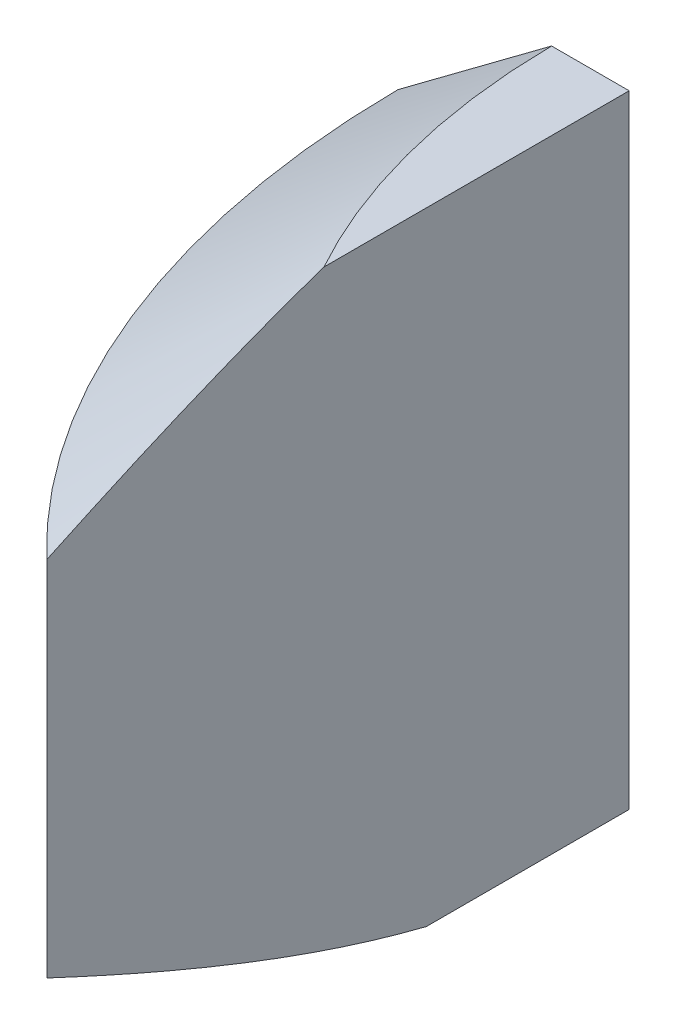
ISO-10303-21;
HEADER;
FILE_DESCRIPTION(('STEP AP214'),'2;1');
FILE_NAME('part.step','',(''),(''),'','','');
FILE_SCHEMA(('AUTOMOTIVE_DESIGN { 1 0 10303 214 1 1 1 1 }'));
ENDSEC;
DATA;
#1=APPLICATION_CONTEXT('core data for automotive mechanical design processes');
#2=APPLICATION_PROTOCOL_DEFINITION('international standard','automotive_design',2000,#1);
#3=PRODUCT_CONTEXT('',#1,'mechanical');
#4=PRODUCT('Part','Part','',(#3));
#5=PRODUCT_RELATED_PRODUCT_CATEGORY('part','',(#4));
#6=PRODUCT_DEFINITION_FORMATION('','',#4);
#7=PRODUCT_DEFINITION_CONTEXT('part definition',#1,'design');
#8=PRODUCT_DEFINITION('design','',#6,#7);
#9=PRODUCT_DEFINITION_SHAPE('','',#8);
#10=(LENGTH_UNIT() NAMED_UNIT(*) SI_UNIT(.MILLI.,.METRE.));
#11=(NAMED_UNIT(*) PLANE_ANGLE_UNIT() SI_UNIT($,.RADIAN.));
#12=(NAMED_UNIT(*) SI_UNIT($,.STERADIAN.) SOLID_ANGLE_UNIT());
#13=UNCERTAINTY_MEASURE_WITH_UNIT(LENGTH_MEASURE(1.E-05),#10,'distance_accuracy_value','');
#14=(GEOMETRIC_REPRESENTATION_CONTEXT(3) GLOBAL_UNCERTAINTY_ASSIGNED_CONTEXT((#13)) GLOBAL_UNIT_ASSIGNED_CONTEXT((#10,
#11,#12)) REPRESENTATION_CONTEXT('',''));
#15=CARTESIAN_POINT('',(0.,0.,0.));
#16=DIRECTION('',(0.,0.,1.));
#17=DIRECTION('',(1.,0.,0.));
#18=AXIS2_PLACEMENT_3D('',#15,#16,#17);
#19=CARTESIAN_POINT('',(0.,0.,150.));
#20=DIRECTION('',(0.,0.,1.));
#21=DIRECTION('',(1.,0.,0.));
#22=AXIS2_PLACEMENT_3D('',#19,#20,#21);
#23=PLANE('',#22);
#24=DIRECTION('',(1.,0.,0.));
#25=VECTOR('',#24,1.);
#26=CARTESIAN_POINT('',(-308.554799780113,77.7625120885841,150.));
#27=LINE('',#26,#25);
#28=CARTESIAN_POINT('',(-308.553137339858,77.7625120885842,150.));
#29=VERTEX_POINT('',#28);
#30=CARTESIAN_POINT('',(-300.,77.7625120885841,149.999999999977));
#31=VERTEX_POINT('',#30);
#32=EDGE_CURVE('E163',#29,#31,#27,.T.);
#33=ORIENTED_EDGE('',*,*,#32,.T.);
#34=DIRECTION('',(0.,-1.,0.));
#35=VECTOR('',#34,1.);
#36=CARTESIAN_POINT('',(-300.,0.,150.));
#37=LINE('',#36,#35);
#38=CARTESIAN_POINT('',(-300.,9.11891061329304,149.999999999977));
#39=VERTEX_POINT('',#38);
#40=EDGE_CURVE('E39',#31,#39,#37,.T.);
#41=ORIENTED_EDGE('',*,*,#40,.T.);
#42=DIRECTION('',(-1.,0.,0.));
#43=VECTOR('',#42,1.);
#44=CARTESIAN_POINT('',(-304.054799780113,9.11891061329304,150.));
#45=LINE('',#44,#43);
#46=CARTESIAN_POINT('',(-304.052957277802,9.11891061329304,150.));
#47=VERTEX_POINT('',#46);
#48=EDGE_CURVE('E44',#39,#47,#45,.T.);
#49=ORIENTED_EDGE('',*,*,#48,.T.);
#50=CARTESIAN_POINT('',(-304.052957277802,9.11891061329304,150.));
#51=CARTESIAN_POINT('',(-307.628340813314,11.7855528874402,150.));
#52=CARTESIAN_POINT('',(-311.20371239795,14.4522111849503,150.));
#53=CARTESIAN_POINT('',(-316.566758271069,18.4522140552676,150.));
#54=CARTESIAN_POINT('',(-318.354438311504,19.7855509160752,150.));
#55=CARTESIAN_POINT('',(-321.929795628149,22.4522283438555,150.));
#56=CARTESIAN_POINT('',(-323.717472904358,23.7855689108282,150.));
#57=CARTESIAN_POINT('',(-325.505149333651,25.1189106132931,150.));
#58=B_SPLINE_CURVE_WITH_KNOTS('',3,(#50,#51,#52,#53,#54,#55,#56,#57),.UNSPECIFIED.,.F.,.F.,(4,2,
2,4),(0.,13.3809243325822,20.0713864991394,26.7618486657284),.UNSPECIFIED.);
#59=CARTESIAN_POINT('',(-325.505149333651,25.118910613293,150.));
#60=VERTEX_POINT('',#59);
#61=EDGE_CURVE('E82',#47,#60,#58,.T.);
#62=ORIENTED_EDGE('',*,*,#61,.T.);
#63=DIRECTION('',(0.,1.,0.));
#64=VECTOR('',#63,1.);
#65=CARTESIAN_POINT('',(-325.505149333651,45.1189106132931,150.));
#66=LINE('',#65,#64);
#67=CARTESIAN_POINT('',(-325.505149333651,65.118910613293,150.));
#68=VERTEX_POINT('',#67);
#69=EDGE_CURVE('E166',#60,#68,#66,.T.);
#70=ORIENTED_EDGE('',*,*,#69,.T.);
#71=CARTESIAN_POINT('',(-325.505149333651,65.1189106132931,150.));
#72=CARTESIAN_POINT('',(-324.092485212729,66.1725488228257,150.));
#73=CARTESIAN_POINT('',(-322.67982050428,67.226186244635,150.));
#74=CARTESIAN_POINT('',(-319.854489464162,69.3334589119173,150.));
#75=CARTESIAN_POINT('',(-318.441823132493,70.3870941573903,150.));
#76=CARTESIAN_POINT('',(-314.203821030365,73.5479957280012,150.));
#77=CARTESIAN_POINT('',(-311.378482152828,75.6552578872993,150.));
#78=CARTESIAN_POINT('',(-308.553137339858,77.7625120885841,150.));
#79=B_SPLINE_CURVE_WITH_KNOTS('',3,(#71,#72,#73,#74,#75,#76,#77,#78),.UNSPECIFIED.,.F.,.F.,(4,2,
2,4),(0.,5.28696137267602,10.5739227453527,21.1478454908659),.UNSPECIFIED.);
#80=EDGE_CURVE('E148',#68,#29,#79,.T.);
#81=ORIENTED_EDGE('',*,*,#80,.T.);
#82=EDGE_LOOP('',(#33,#41,#49,#62,#70,#81));
#83=FACE_BOUND('',#82,.T.);
#84=ADVANCED_FACE('F34',(#83),#23,.F.);
#85=CARTESIAN_POINT('',(-262.506364446809,25.1189106132931,230.000026632189));
#86=CARTESIAN_POINT('',(-136.506364446809,25.1189106132931,230.000026632189));
#87=CARTESIAN_POINT('',(-136.506364446809,25.1189106132931,69.0000266321888));
#88=CARTESIAN_POINT('',(-262.506364446809,25.1189106132931,69.0000266321888));
#89=CARTESIAN_POINT('',(-388.506364446809,25.1189106132931,69.0000266321888));
#90=CARTESIAN_POINT('',(-388.506364446809,25.1189106132931,230.000026632189));
#91=CARTESIAN_POINT('',(-262.506364446809,25.1189106132931,230.000026632189));
#92=CARTESIAN_POINT('',(-262.506364446809,9.11891061329303,202.589694002522));
#93=CARTESIAN_POINT('',(-179.409493780201,9.11891061329304,202.589694002522));
#94=CARTESIAN_POINT('',(-179.409493780201,9.11891061329304,96.410359261856));
#95=CARTESIAN_POINT('',(-262.506364446809,9.11891061329304,96.410359261856));
#96=CARTESIAN_POINT('',(-345.603235113417,9.11891061329304,96.410359261856));
#97=CARTESIAN_POINT('',(-345.603235113417,9.11891061329304,202.589694002522));
#98=CARTESIAN_POINT('',(-262.506364446809,9.11891061329303,202.589694002522));
#99=(BOUNDED_SURFACE() B_SPLINE_SURFACE(1,3,((#85,#86,#87,#88,#89,#90,#91),(#92,#93,#94,#95,#96,
#97,#98)),.UNSPECIFIED.,.F.,.T.,.F.) B_SPLINE_SURFACE_WITH_KNOTS((2,2),(4,3,4),(0.,1.),(0.,0.5,
1.),.UNSPECIFIED.) GEOMETRIC_REPRESENTATION_ITEM() RATIONAL_B_SPLINE_SURFACE(((1.,
0.333333333333333,0.333333333333333,1.,0.333333333333333,0.333333333333333,1.),(1.,
0.333333333333333,0.333333333333333,1.,0.333333333333333,0.333333333333333,1.))) REPRESENTATION_ITEM('') SURFACE());
#100=CARTESIAN_POINT('',(-300.,9.11891061329303,172.375452770228));
#101=CARTESIAN_POINT('',(-300.,9.30008329530467,173.095757458267));
#102=CARTESIAN_POINT('',(-300.,9.48779693840823,173.814400042721));
#103=CARTESIAN_POINT('',(-300.,9.87538920342915,175.248280241861));
#104=CARTESIAN_POINT('',(-300.,10.0752659363197,175.963518366777));
#105=CARTESIAN_POINT('',(-300.,10.4863157554245,177.390702994637));
#106=CARTESIAN_POINT('',(-300.,10.6974883815921,178.102649630351));
#107=CARTESIAN_POINT('',(-300.,11.1301119663296,179.522715886379));
#108=CARTESIAN_POINT('',(-300.,11.3515535939504,180.230838352636));
#109=CARTESIAN_POINT('',(-300.,11.8041134629194,181.644010270722));
#110=CARTESIAN_POINT('',(-300.,12.0352320664581,182.349059606436));
#111=CARTESIAN_POINT('',(-300.,12.506408040201,183.756169029804));
#112=CARTESIAN_POINT('',(-300.,12.7464655090062,184.458229084389));
#113=CARTESIAN_POINT('',(-300.,13.3566949315673,186.209123900045));
#114=CARTESIAN_POINT('',(-300.,13.7320136714519,187.256166859088));
#115=CARTESIAN_POINT('',(-300.,14.4990965425146,189.344180708625));
#116=CARTESIAN_POINT('',(-300.,14.8908604835406,190.385151669168));
#117=CARTESIAN_POINT('',(-300.,15.6891783898497,192.461938277392));
#118=CARTESIAN_POINT('',(-300.,16.0957389462093,193.497751388096));
#119=CARTESIAN_POINT('',(-300.,16.9218608293465,195.564181395965));
#120=CARTESIAN_POINT('',(-300.,17.341422246315,196.594798257023));
#121=CARTESIAN_POINT('',(-300.,18.151940456186,198.554111744623));
#122=CARTESIAN_POINT('',(-300.,18.5418556370308,199.483239902606));
#123=CARTESIAN_POINT('',(-300.,19.3302494151967,201.337864368713));
#124=CARTESIAN_POINT('',(-300.,19.728728097909,202.263360640513));
#125=CARTESIAN_POINT('',(-300.,20.533423880845,204.111000521892));
#126=CARTESIAN_POINT('',(-300.,20.9396411238455,205.033144069239));
#127=CARTESIAN_POINT('',(-300.,21.7586768809874,206.873423545967));
#128=CARTESIAN_POINT('',(-300.,22.1714886234257,207.791562490963));
#129=CARTESIAN_POINT('',(-300.,23.0034334162562,209.624945312642));
#130=CARTESIAN_POINT('',(-300.,23.4225663267268,210.540189252866));
#131=CARTESIAN_POINT('',(-300.,24.2665698959102,212.367955154461));
#132=CARTESIAN_POINT('',(-300.,24.6914401741691,213.280477291466));
#133=CARTESIAN_POINT('',(-300.,25.1189106132931,214.191775252119));
#134=B_SPLINE_CURVE_WITH_KNOTS('',3,(#100,#101,#102,#103,#104,#105,#106,#107,#108,#109,#110,
#111,#112,#113,#114,#115,#116,#117,#118,#119,#120,#121,#122,#123,#124,#125,#126,#127,#128,#129,
#130,#131,#132,#133),.UNSPECIFIED.,.F.,.F.,(4,2,2,2,2,2,2,2,2,2,2,2,2,2,2,2,4),(0.,
2.2281647753546,4.45598437743841,6.6837133163347,8.90945623874295,11.1352825409637,
13.3611334026019,16.697801608261,20.0344312434159,23.3725658049996,26.7107235293668,
29.7335596845308,32.7564259959922,35.7793481336119,38.7993436580956,41.8192724316082,
44.839001922876),.UNSPECIFIED.);
#135=CARTESIAN_POINT('',(-300.,9.11891061329304,172.375452770228));
#136=VERTEX_POINT('',#135);
#137=CARTESIAN_POINT('',(-300.,25.118910613293,214.191775252119));
#138=VERTEX_POINT('',#137);
#139=EDGE_CURVE('E89',#136,#138,#134,.T.);
#140=CARTESIAN_POINT('',(-325.506364446809,25.118910613293,149.500026632189));
#141=CARTESIAN_POINT('',(-325.506364446809,25.118910613293,196.655834861155));
#142=CARTESIAN_POINT('',(-299.410910017304,25.118910613293,230.000026632189));
#143=CARTESIAN_POINT('',(-262.506364446809,25.118910613293,230.000026632189));
#144=(BOUNDED_CURVE() B_SPLINE_CURVE(3,(#140,#141,#142,#143),.UNSPECIFIED.,.F.,
.F.) B_SPLINE_CURVE_WITH_KNOTS((4,4),(0.,1.),
.UNSPECIFIED.) CURVE() GEOMETRIC_REPRESENTATION_ITEM() RATIONAL_B_SPLINE_CURVE((1.,
0.804737854124365,0.804737854124365,1.)) REPRESENTATION_ITEM(''));
#145=EDGE_CURVE('E87',#60,#138,#144,.T.);
#146=CARTESIAN_POINT('',(-304.054799780113,9.11891061329304,149.500026632189));
#147=CARTESIAN_POINT('',(-304.054799780113,9.11891061329305,180.599233755854));
#148=CARTESIAN_POINT('',(-286.844874369677,9.11891061329304,202.589694002522));
#149=CARTESIAN_POINT('',(-262.506364446809,9.11891061329304,202.589694002522));
#150=(BOUNDED_CURVE() B_SPLINE_CURVE(3,(#146,#147,#148,#149),.UNSPECIFIED.,.F.,
.F.) B_SPLINE_CURVE_WITH_KNOTS((4,4),(0.,1.),
.UNSPECIFIED.) CURVE() GEOMETRIC_REPRESENTATION_ITEM() RATIONAL_B_SPLINE_CURVE((1.,
0.804737854124365,0.804737854124365,1.)) REPRESENTATION_ITEM(''));
#151=EDGE_CURVE('E85',#47,#136,#150,.T.);
#152=ORIENTED_EDGE('',*,*,#139,.T.);
#153=ORIENTED_EDGE('',*,*,#145,.F.);
#154=ORIENTED_EDGE('',*,*,#61,.F.);
#155=ORIENTED_EDGE('',*,*,#151,.T.);
#156=EDGE_LOOP('',(#152,#153,#154,#155));
#157=FACE_BOUND('',#156,.T.);
#158=ADVANCED_FACE('F83',(#157),#99,.T.);
#159=CARTESIAN_POINT('',(-262.506364446809,9.11891061329304,230.000026632189));
#160=CARTESIAN_POINT('',(-136.506364446809,9.11891061329304,230.000026632189));
#161=CARTESIAN_POINT('',(-136.506364446809,9.11891061329304,69.0000266321888));
#162=CARTESIAN_POINT('',(-262.506364446809,9.11891061329303,69.0000266321888));
#163=CARTESIAN_POINT('',(-388.506364446809,9.11891061329304,69.0000266321888));
#164=CARTESIAN_POINT('',(-388.506364446809,9.11891061329304,230.000026632189));
#165=CARTESIAN_POINT('',(-262.506364446809,9.11891061329304,230.000026632189));
#166=(BOUNDED_CURVE() B_SPLINE_CURVE(3,(#159,#160,#161,#162,#163,#164,#165),.UNSPECIFIED.,.T.,
.F.) B_SPLINE_CURVE_WITH_KNOTS((4,3,4),(0.,0.5,1.),
.UNSPECIFIED.) CURVE() GEOMETRIC_REPRESENTATION_ITEM() RATIONAL_B_SPLINE_CURVE((1.,
0.333333333333333,0.333333333333333,1.,0.333333333333333,0.333333333333333,1.)) REPRESENTATION_ITEM(''));
#167=DIRECTION('',(0.,1.,0.));
#168=VECTOR('',#167,1.);
#169=SURFACE_OF_LINEAR_EXTRUSION('',#166,#168);
#170=DIRECTION('',(0.,1.,0.));
#171=VECTOR('',#170,1.);
#172=CARTESIAN_POINT('',(-300.,45.1189106132931,214.191775252119));
#173=LINE('',#172,#171);
#174=CARTESIAN_POINT('',(-300.,65.1189106132931,214.191775252119));
#175=VERTEX_POINT('',#174);
#176=EDGE_CURVE('E165',#138,#175,#173,.T.);
#177=ORIENTED_EDGE('',*,*,#176,.T.);
#178=CARTESIAN_POINT('',(-325.506364446809,65.1189106132931,149.500026632189));
#179=CARTESIAN_POINT('',(-325.506364446809,65.1189106132931,196.655834861155));
#180=CARTESIAN_POINT('',(-299.410910017304,65.1189106132931,230.000026632189));
#181=CARTESIAN_POINT('',(-262.506364446809,65.1189106132931,230.000026632189));
#182=(BOUNDED_CURVE() B_SPLINE_CURVE(3,(#178,#179,#180,#181),.UNSPECIFIED.,.F.,
.F.) B_SPLINE_CURVE_WITH_KNOTS((4,4),(0.,1.),
.UNSPECIFIED.) CURVE() GEOMETRIC_REPRESENTATION_ITEM() RATIONAL_B_SPLINE_CURVE((1.,
0.804737854124365,0.804737854124365,1.)) REPRESENTATION_ITEM(''));
#183=EDGE_CURVE('E96',#68,#175,#182,.T.);
#184=ORIENTED_EDGE('',*,*,#183,.F.);
#185=ORIENTED_EDGE('',*,*,#69,.F.);
#186=ORIENTED_EDGE('',*,*,#145,.T.);
#187=EDGE_LOOP('',(#177,#184,#185,#186));
#188=FACE_BOUND('',#187,.T.);
#189=ADVANCED_FACE('F170',(#188),#169,.T.);
#190=CARTESIAN_POINT('',(-308.554799780113,77.7625120885842,-149.499973367811));
#191=DIRECTION('',(0.,1.,0.));
#192=DIRECTION('',(-1.,0.,0.));
#193=AXIS2_PLACEMENT_3D('',#190,#191,#192);
#194=PLANE('',#193);
#195=DIRECTION('',(0.,0.,-1.));
#196=VECTOR('',#195,1.);
#197=CARTESIAN_POINT('',(-300.,77.7625120885841,-149.499973367811));
#198=LINE('',#197,#196);
#199=CARTESIAN_POINT('',(-300.,77.7625120885841,183.659634296149));
#200=VERTEX_POINT('',#199);
#201=EDGE_CURVE('E156',#200,#31,#198,.T.);
#202=ORIENTED_EDGE('',*,*,#201,.T.);
#203=ORIENTED_EDGE('',*,*,#32,.F.);
#204=CARTESIAN_POINT('',(-308.554799780113,77.7625120885841,149.500026632189));
#205=CARTESIAN_POINT('',(-308.554799780113,77.7625120885842,183.967505772208));
#206=CARTESIAN_POINT('',(-289.480913338998,77.7625120885841,208.339694002522));
#207=CARTESIAN_POINT('',(-262.506364446809,77.7625120885841,208.339694002522));
#208=(BOUNDED_CURVE() B_SPLINE_CURVE(3,(#204,#205,#206,#207),.UNSPECIFIED.,.F.,
.F.) B_SPLINE_CURVE_WITH_KNOTS((4,4),(0.,1.),
.UNSPECIFIED.) CURVE() GEOMETRIC_REPRESENTATION_ITEM() RATIONAL_B_SPLINE_CURVE((1.,
0.804737854124365,0.804737854124365,1.)) REPRESENTATION_ITEM(''));
#209=EDGE_CURVE('E90',#29,#200,#208,.T.);
#210=ORIENTED_EDGE('',*,*,#209,.T.);
#211=EDGE_LOOP('',(#202,#203,#210));
#212=FACE_BOUND('',#211,.T.);
#213=ADVANCED_FACE('F177',(#212),#194,.T.);
#214=CARTESIAN_POINT('',(-262.506364446809,65.1189106132931,69.0000266321888));
#215=CARTESIAN_POINT('',(-136.506364446809,65.1189106132931,69.0000266321888));
#216=CARTESIAN_POINT('',(-136.506364446809,65.1189106132931,230.000026632189));
#217=CARTESIAN_POINT('',(-262.506364446809,65.1189106132931,230.000026632189));
#218=CARTESIAN_POINT('',(-388.506364446809,65.1189106132931,230.000026632189));
#219=CARTESIAN_POINT('',(-388.506364446809,65.1189106132931,69.0000266321888));
#220=CARTESIAN_POINT('',(-262.506364446809,65.1189106132931,69.0000266321888));
#221=CARTESIAN_POINT('',(-262.506364446809,77.7625120885841,90.6603592618559));
#222=CARTESIAN_POINT('',(-170.409493780201,77.7625120885841,90.6603592618559));
#223=CARTESIAN_POINT('',(-170.409493780201,77.7625120885841,208.339694002522));
#224=CARTESIAN_POINT('',(-262.506364446809,77.7625120885841,208.339694002522));
#225=CARTESIAN_POINT('',(-354.603235113417,77.7625120885841,208.339694002522));
#226=CARTESIAN_POINT('',(-354.603235113417,77.7625120885841,90.6603592618559));
#227=CARTESIAN_POINT('',(-262.506364446809,77.7625120885841,90.6603592618559));
#228=(BOUNDED_SURFACE() B_SPLINE_SURFACE(1,3,((#214,#215,#216,#217,#218,#219,#220),(#221,#222,
#223,#224,#225,#226,#227)),.UNSPECIFIED.,.F.,.T.,.F.) B_SPLINE_SURFACE_WITH_KNOTS((2,2),(4,3,4),
(0.,1.),(0.,0.5,1.),
.UNSPECIFIED.) GEOMETRIC_REPRESENTATION_ITEM() RATIONAL_B_SPLINE_SURFACE(((1.,0.333333333333333,
0.333333333333333,1.,0.333333333333333,0.333333333333333,1.),(1.,0.333333333333333,
0.333333333333333,1.,0.333333333333333,0.333333333333333,1.))) REPRESENTATION_ITEM('') SURFACE());
#229=CARTESIAN_POINT('',(-300.,65.1189106132931,214.191775252119));
#230=CARTESIAN_POINT('',(-300.,65.4920197709864,213.396379709631));
#231=CARTESIAN_POINT('',(-300.,65.8631399345404,212.600051862519));
#232=CARTESIAN_POINT('',(-300.,66.601044600786,211.005383529047));
#233=CARTESIAN_POINT('',(-300.,66.9678290731159,210.207043028639));
#234=CARTESIAN_POINT('',(-300.,68.0612811880413,207.808475756033));
#235=CARTESIAN_POINT('',(-300.,68.7808972024488,206.20502294502));
#236=CARTESIAN_POINT('',(-300.,70.2452357324348,202.880656073343));
#237=CARTESIAN_POINT('',(-300.,70.9884161657824,201.159061630169));
#238=CARTESIAN_POINT('',(-300.,72.4440550739136,197.703110451201));
#239=CARTESIAN_POINT('',(-300.,73.1565171663818,195.968755246554));
#240=CARTESIAN_POINT('',(-300.,74.1978174911854,193.354638134876));
#241=CARTESIAN_POINT('',(-300.,74.5406272948471,192.480432094693));
#242=CARTESIAN_POINT('',(-300.,75.215892800739,190.728035691367));
#243=CARTESIAN_POINT('',(-300.,75.5483486263114,189.84984537583));
#244=CARTESIAN_POINT('',(-300.,76.2019153561108,188.088987386069));
#245=CARTESIAN_POINT('',(-300.,76.5230233025783,187.206318612123));
#246=CARTESIAN_POINT('',(-300.,77.1525778052279,185.436437997816));
#247=CARTESIAN_POINT('',(-300.,77.4610238207002,184.549225965257));
#248=CARTESIAN_POINT('',(-300.,77.7625120885841,183.659634296149));
#249=B_SPLINE_CURVE_WITH_KNOTS('',3,(#229,#230,#231,#232,#233,#234,#235,#236,#237,#238,#239,
#240,#241,#242,#243,#244,#245,#246,#247,#248),.UNSPECIFIED.,.F.,.F.,(4,2,2,2,2,2,2,2,2,4),(0.,
2.63566940212472,5.27135725025529,10.5437928113635,16.1690273772319,21.7935976421419,
24.6105978512877,27.4275644899267,30.2452600193124,33.0630757494928),.UNSPECIFIED.);
#250=EDGE_CURVE('E93',#175,#200,#249,.T.);
#251=ORIENTED_EDGE('',*,*,#250,.T.);
#252=ORIENTED_EDGE('',*,*,#209,.F.);
#253=ORIENTED_EDGE('',*,*,#80,.F.);
#254=ORIENTED_EDGE('',*,*,#183,.T.);
#255=EDGE_LOOP('',(#251,#252,#253,#254));
#256=FACE_BOUND('',#255,.T.);
#257=ADVANCED_FACE('F141',(#256),#228,.T.);
#258=CARTESIAN_POINT('',(-304.054799780113,9.11891061329304,-149.499973367811));
#259=DIRECTION('',(0.,-1.,0.));
#260=DIRECTION('',(1.,0.,0.));
#261=AXIS2_PLACEMENT_3D('',#258,#259,#260);
#262=PLANE('',#261);
#263=DIRECTION('',(0.,0.,1.));
#264=VECTOR('',#263,1.);
#265=CARTESIAN_POINT('',(-300.,9.11891061329304,-149.499973367811));
#266=LINE('',#265,#264);
#267=EDGE_CURVE('E11',#39,#136,#266,.T.);
#268=ORIENTED_EDGE('',*,*,#267,.T.);
#269=ORIENTED_EDGE('',*,*,#151,.F.);
#270=ORIENTED_EDGE('',*,*,#48,.F.);
#271=EDGE_LOOP('',(#268,#269,#270));
#272=FACE_BOUND('',#271,.T.);
#273=ADVANCED_FACE('F95',(#272),#262,.T.);
#274=CARTESIAN_POINT('',(-300.,0.,0.));
#275=DIRECTION('',(1.,0.,0.));
#276=DIRECTION('',(0.,0.,-1.));
#277=AXIS2_PLACEMENT_3D('',#274,#275,#276);
#278=PLANE('',#277);
#279=ORIENTED_EDGE('',*,*,#201,.F.);
#280=ORIENTED_EDGE('',*,*,#250,.F.);
#281=ORIENTED_EDGE('',*,*,#176,.F.);
#282=ORIENTED_EDGE('',*,*,#139,.F.);
#283=ORIENTED_EDGE('',*,*,#267,.F.);
#284=ORIENTED_EDGE('',*,*,#40,.F.);
#285=EDGE_LOOP('',(#279,#280,#281,#282,#283,#284));
#286=FACE_BOUND('',#285,.T.);
#287=ADVANCED_FACE('F36',(#286),#278,.T.);
#288=CLOSED_SHELL('',(#84,#158,#189,#213,#257,#273,#287));
#289=MANIFOLD_SOLID_BREP('B2',#288);
#290=ADVANCED_BREP_SHAPE_REPRESENTATION('',(#18,#289),#14);
#291=SHAPE_DEFINITION_REPRESENTATION(#9,#290);
ENDSEC;
END-ISO-10303-21;
